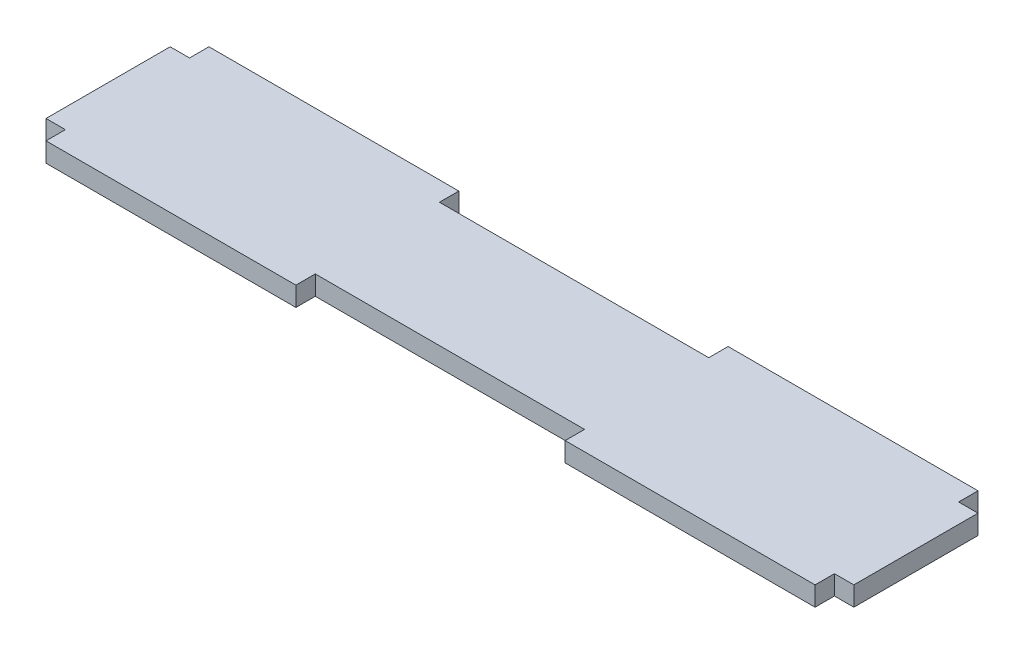
ISO-10303-21;
HEADER;
FILE_DESCRIPTION(('STEP AP214'),'2;1');
FILE_NAME('part.step','',(''),(''),'','','');
FILE_SCHEMA(('AUTOMOTIVE_DESIGN { 1 0 10303 214 1 1 1 1 }'));
ENDSEC;
DATA;
#1=APPLICATION_CONTEXT('core data for automotive mechanical design processes');
#2=APPLICATION_PROTOCOL_DEFINITION('international standard','automotive_design',2000,#1);
#3=PRODUCT_CONTEXT('',#1,'mechanical');
#4=PRODUCT('Part','Part','',(#3));
#5=PRODUCT_RELATED_PRODUCT_CATEGORY('part','',(#4));
#6=PRODUCT_DEFINITION_FORMATION('','',#4);
#7=PRODUCT_DEFINITION_CONTEXT('part definition',#1,'design');
#8=PRODUCT_DEFINITION('design','',#6,#7);
#9=PRODUCT_DEFINITION_SHAPE('','',#8);
#10=(LENGTH_UNIT() NAMED_UNIT(*) SI_UNIT(.MILLI.,.METRE.));
#11=(NAMED_UNIT(*) PLANE_ANGLE_UNIT() SI_UNIT($,.RADIAN.));
#12=(NAMED_UNIT(*) SI_UNIT($,.STERADIAN.) SOLID_ANGLE_UNIT());
#13=UNCERTAINTY_MEASURE_WITH_UNIT(LENGTH_MEASURE(1.E-05),#10,'distance_accuracy_value','');
#14=(GEOMETRIC_REPRESENTATION_CONTEXT(3) GLOBAL_UNCERTAINTY_ASSIGNED_CONTEXT((#13)) GLOBAL_UNIT_ASSIGNED_CONTEXT((#10,
#11,#12)) REPRESENTATION_CONTEXT('',''));
#15=CARTESIAN_POINT('',(0.,0.,0.));
#16=DIRECTION('',(0.,0.,1.));
#17=DIRECTION('',(1.,0.,0.));
#18=AXIS2_PLACEMENT_3D('',#15,#16,#17);
#19=CARTESIAN_POINT('',(125.,9.,-25.2125));
#20=DIRECTION('',(0.,0.,-1.));
#21=DIRECTION('',(-1.,0.,0.));
#22=AXIS2_PLACEMENT_3D('',#19,#20,#21);
#23=PLANE('',#22);
#24=DIRECTION('',(1.,0.,0.));
#25=VECTOR('',#24,1.);
#26=CARTESIAN_POINT('',(125.,3.,-25.2125));
#27=LINE('',#26,#25);
#28=CARTESIAN_POINT('',(131.,3.,-25.2125));
#29=VERTEX_POINT('',#28);
#30=CARTESIAN_POINT('',(208.333333333333,3.,-25.2125));
#31=VERTEX_POINT('',#30);
#32=EDGE_CURVE('E189',#29,#31,#27,.T.);
#33=ORIENTED_EDGE('',*,*,#32,.T.);
#34=DIRECTION('',(0.,1.,0.));
#35=VECTOR('',#34,1.);
#36=CARTESIAN_POINT('',(208.333333333333,3.,-25.2125));
#37=LINE('',#36,#35);
#38=CARTESIAN_POINT('',(208.333333333333,9.,-25.2125));
#39=VERTEX_POINT('',#38);
#40=EDGE_CURVE('E173',#31,#39,#37,.T.);
#41=ORIENTED_EDGE('',*,*,#40,.T.);
#42=DIRECTION('',(1.,0.,0.));
#43=VECTOR('',#42,1.);
#44=CARTESIAN_POINT('',(125.,9.,-25.2125));
#45=LINE('',#44,#43);
#46=CARTESIAN_POINT('',(131.,9.,-25.2125));
#47=VERTEX_POINT('',#46);
#48=EDGE_CURVE('E209',#47,#39,#45,.T.);
#49=ORIENTED_EDGE('',*,*,#48,.F.);
#50=DIRECTION('',(0.,1.,0.));
#51=VECTOR('',#50,1.);
#52=CARTESIAN_POINT('',(131.,3.,-25.2125));
#53=LINE('',#52,#51);
#54=EDGE_CURVE('E195',#29,#47,#53,.T.);
#55=ORIENTED_EDGE('',*,*,#54,.F.);
#56=EDGE_LOOP('',(#33,#41,#49,#55));
#57=FACE_BOUND('',#56,.T.);
#58=ADVANCED_FACE('F34',(#57),#23,.F.);
#59=CARTESIAN_POINT('',(125.,9.,-75.6375));
#60=DIRECTION('',(0.,0.,1.));
#61=DIRECTION('',(1.,0.,0.));
#62=AXIS2_PLACEMENT_3D('',#59,#60,#61);
#63=PLANE('',#62);
#64=DIRECTION('',(-1.,0.,0.));
#65=VECTOR('',#64,1.);
#66=CARTESIAN_POINT('',(125.,9.,-75.6375));
#67=LINE('',#66,#65);
#68=CARTESIAN_POINT('',(208.333333333333,9.,-75.6375));
#69=VERTEX_POINT('',#68);
#70=CARTESIAN_POINT('',(131.,9.,-75.6375));
#71=VERTEX_POINT('',#70);
#72=EDGE_CURVE('E43',#69,#71,#67,.T.);
#73=ORIENTED_EDGE('',*,*,#72,.F.);
#74=DIRECTION('',(0.,1.,0.));
#75=VECTOR('',#74,1.);
#76=CARTESIAN_POINT('',(208.333333333333,3.,-75.6375));
#77=LINE('',#76,#75);
#78=CARTESIAN_POINT('',(208.333333333333,3.,-75.6375));
#79=VERTEX_POINT('',#78);
#80=EDGE_CURVE('E248',#79,#69,#77,.T.);
#81=ORIENTED_EDGE('',*,*,#80,.F.);
#82=DIRECTION('',(-1.,0.,0.));
#83=VECTOR('',#82,1.);
#84=CARTESIAN_POINT('',(125.,3.,-75.6375));
#85=LINE('',#84,#83);
#86=CARTESIAN_POINT('',(131.,3.,-75.6375));
#87=VERTEX_POINT('',#86);
#88=EDGE_CURVE('E200',#79,#87,#85,.T.);
#89=ORIENTED_EDGE('',*,*,#88,.T.);
#90=DIRECTION('',(0.,1.,0.));
#91=VECTOR('',#90,1.);
#92=CARTESIAN_POINT('',(131.,3.,-75.6375));
#93=LINE('',#92,#91);
#94=EDGE_CURVE('E257',#87,#71,#93,.T.);
#95=ORIENTED_EDGE('',*,*,#94,.T.);
#96=EDGE_LOOP('',(#73,#81,#89,#95));
#97=FACE_BOUND('',#96,.T.);
#98=ADVANCED_FACE('F372',(#97),#63,.F.);
#99=CARTESIAN_POINT('',(125.,9.,-25.2125));
#100=DIRECTION('',(1.,0.,0.));
#101=DIRECTION('',(0.,0.,-1.));
#102=AXIS2_PLACEMENT_3D('',#99,#100,#101);
#103=PLANE('',#102);
#104=DIRECTION('',(0.,0.,1.));
#105=VECTOR('',#104,1.);
#106=CARTESIAN_POINT('',(125.,9.,-25.2125));
#107=LINE('',#106,#105);
#108=CARTESIAN_POINT('',(125.,9.,-69.6375));
#109=VERTEX_POINT('',#108);
#110=CARTESIAN_POINT('',(125.,9.,-31.2125));
#111=VERTEX_POINT('',#110);
#112=EDGE_CURVE('E212',#109,#111,#107,.T.);
#113=ORIENTED_EDGE('',*,*,#112,.F.);
#114=DIRECTION('',(0.,1.,0.));
#115=VECTOR('',#114,1.);
#116=CARTESIAN_POINT('',(125.,3.,-69.6375));
#117=LINE('',#116,#115);
#118=CARTESIAN_POINT('',(125.,3.,-69.6375));
#119=VERTEX_POINT('',#118);
#120=EDGE_CURVE('E252',#119,#109,#117,.T.);
#121=ORIENTED_EDGE('',*,*,#120,.F.);
#122=DIRECTION('',(0.,0.,1.));
#123=VECTOR('',#122,1.);
#124=CARTESIAN_POINT('',(125.,3.,-25.2125));
#125=LINE('',#124,#123);
#126=CARTESIAN_POINT('',(125.,3.,-31.2125));
#127=VERTEX_POINT('',#126);
#128=EDGE_CURVE('E201',#119,#127,#125,.T.);
#129=ORIENTED_EDGE('',*,*,#128,.T.);
#130=DIRECTION('',(0.,1.,0.));
#131=VECTOR('',#130,1.);
#132=CARTESIAN_POINT('',(125.,3.,-31.2125));
#133=LINE('',#132,#131);
#134=EDGE_CURVE('E238',#127,#111,#133,.T.);
#135=ORIENTED_EDGE('',*,*,#134,.T.);
#136=EDGE_LOOP('',(#113,#121,#129,#135));
#137=FACE_BOUND('',#136,.T.);
#138=ADVANCED_FACE('F36',(#137),#103,.F.);
#139=CARTESIAN_POINT('',(291.666666666667,9.,-25.2125));
#140=VERTEX_POINT('',#139);
#141=CARTESIAN_POINT('',(369.,9.,-25.2125));
#142=VERTEX_POINT('',#141);
#143=EDGE_CURVE('E211',#140,#142,#45,.T.);
#144=ORIENTED_EDGE('',*,*,#143,.F.);
#145=DIRECTION('',(0.,1.,0.));
#146=VECTOR('',#145,1.);
#147=CARTESIAN_POINT('',(291.666666666667,3.,-25.2125));
#148=LINE('',#147,#146);
#149=CARTESIAN_POINT('',(291.666666666667,3.,-25.2125));
#150=VERTEX_POINT('',#149);
#151=EDGE_CURVE('E183',#150,#140,#148,.T.);
#152=ORIENTED_EDGE('',*,*,#151,.F.);
#153=CARTESIAN_POINT('',(369.,3.,-25.2125));
#154=VERTEX_POINT('',#153);
#155=EDGE_CURVE('E197',#150,#154,#27,.T.);
#156=ORIENTED_EDGE('',*,*,#155,.T.);
#157=DIRECTION('',(0.,1.,0.));
#158=VECTOR('',#157,1.);
#159=CARTESIAN_POINT('',(369.,3.,-25.2125));
#160=LINE('',#159,#158);
#161=EDGE_CURVE('E204',#154,#142,#160,.T.);
#162=ORIENTED_EDGE('',*,*,#161,.T.);
#163=EDGE_LOOP('',(#144,#152,#156,#162));
#164=FACE_BOUND('',#163,.T.);
#165=ADVANCED_FACE('F329',(#164),#23,.F.);
#166=CARTESIAN_POINT('',(375.,9.,-25.2125));
#167=DIRECTION('',(-1.,0.,0.));
#168=DIRECTION('',(0.,0.,1.));
#169=AXIS2_PLACEMENT_3D('',#166,#167,#168);
#170=PLANE('',#169);
#171=DIRECTION('',(0.,0.,-1.));
#172=VECTOR('',#171,1.);
#173=CARTESIAN_POINT('',(375.,3.,-25.2125));
#174=LINE('',#173,#172);
#175=CARTESIAN_POINT('',(375.,3.,-31.2125));
#176=VERTEX_POINT('',#175);
#177=CARTESIAN_POINT('',(375.,3.,-69.6375));
#178=VERTEX_POINT('',#177);
#179=EDGE_CURVE('E196',#176,#178,#174,.T.);
#180=ORIENTED_EDGE('',*,*,#179,.T.);
#181=DIRECTION('',(0.,1.,0.));
#182=VECTOR('',#181,1.);
#183=CARTESIAN_POINT('',(375.,3.,-69.6375));
#184=LINE('',#183,#182);
#185=CARTESIAN_POINT('',(375.,9.,-69.6375));
#186=VERTEX_POINT('',#185);
#187=EDGE_CURVE('E229',#178,#186,#184,.T.);
#188=ORIENTED_EDGE('',*,*,#187,.T.);
#189=DIRECTION('',(0.,0.,-1.));
#190=VECTOR('',#189,1.);
#191=CARTESIAN_POINT('',(375.,9.,-25.2125));
#192=LINE('',#191,#190);
#193=CARTESIAN_POINT('',(375.,9.,-31.2125));
#194=VERTEX_POINT('',#193);
#195=EDGE_CURVE('E206',#194,#186,#192,.T.);
#196=ORIENTED_EDGE('',*,*,#195,.F.);
#197=DIRECTION('',(0.,1.,0.));
#198=VECTOR('',#197,1.);
#199=CARTESIAN_POINT('',(375.,3.,-31.2125));
#200=LINE('',#199,#198);
#201=EDGE_CURVE('E215',#176,#194,#200,.T.);
#202=ORIENTED_EDGE('',*,*,#201,.F.);
#203=EDGE_LOOP('',(#180,#188,#196,#202));
#204=FACE_BOUND('',#203,.T.);
#205=ADVANCED_FACE('F345',(#204),#170,.F.);
#206=CARTESIAN_POINT('',(369.,3.,-75.6375));
#207=VERTEX_POINT('',#206);
#208=CARTESIAN_POINT('',(291.666666666667,3.,-75.6375));
#209=VERTEX_POINT('',#208);
#210=EDGE_CURVE('E38',#207,#209,#85,.T.);
#211=ORIENTED_EDGE('',*,*,#210,.T.);
#212=DIRECTION('',(0.,1.,0.));
#213=VECTOR('',#212,1.);
#214=CARTESIAN_POINT('',(291.666666666667,3.,-75.6375));
#215=LINE('',#214,#213);
#216=CARTESIAN_POINT('',(291.666666666667,9.,-75.6375));
#217=VERTEX_POINT('',#216);
#218=EDGE_CURVE('E291',#209,#217,#215,.T.);
#219=ORIENTED_EDGE('',*,*,#218,.T.);
#220=CARTESIAN_POINT('',(369.,9.,-75.6375));
#221=VERTEX_POINT('',#220);
#222=EDGE_CURVE('E11',#221,#217,#67,.T.);
#223=ORIENTED_EDGE('',*,*,#222,.F.);
#224=DIRECTION('',(0.,1.,0.));
#225=VECTOR('',#224,1.);
#226=CARTESIAN_POINT('',(369.,3.,-75.6375));
#227=LINE('',#226,#225);
#228=EDGE_CURVE('E271',#207,#221,#227,.T.);
#229=ORIENTED_EDGE('',*,*,#228,.F.);
#230=EDGE_LOOP('',(#211,#219,#223,#229));
#231=FACE_BOUND('',#230,.T.);
#232=ADVANCED_FACE('F358',(#231),#63,.F.);
#233=CARTESIAN_POINT('',(125.,9.,-25.2125));
#234=DIRECTION('',(0.,-1.,0.));
#235=DIRECTION('',(0.,0.,-1.));
#236=AXIS2_PLACEMENT_3D('',#233,#234,#235);
#237=PLANE('',#236);
#238=ORIENTED_EDGE('',*,*,#48,.T.);
#239=DIRECTION('',(0.,0.,1.));
#240=VECTOR('',#239,1.);
#241=CARTESIAN_POINT('',(208.333333333333,9.,-25.2125));
#242=LINE('',#241,#240);
#243=CARTESIAN_POINT('',(208.333333333333,9.,-31.2125));
#244=VERTEX_POINT('',#243);
#245=EDGE_CURVE('E178',#244,#39,#242,.T.);
#246=ORIENTED_EDGE('',*,*,#245,.F.);
#247=DIRECTION('',(-1.,0.,0.));
#248=VECTOR('',#247,1.);
#249=CARTESIAN_POINT('',(208.333333333333,9.,-31.2125));
#250=LINE('',#249,#248);
#251=CARTESIAN_POINT('',(291.666666666667,9.,-31.2125));
#252=VERTEX_POINT('',#251);
#253=EDGE_CURVE('E192',#252,#244,#250,.T.);
#254=ORIENTED_EDGE('',*,*,#253,.F.);
#255=DIRECTION('',(0.,0.,-1.));
#256=VECTOR('',#255,1.);
#257=CARTESIAN_POINT('',(291.666666666667,9.,-25.2125));
#258=LINE('',#257,#256);
#259=EDGE_CURVE('E317',#140,#252,#258,.T.);
#260=ORIENTED_EDGE('',*,*,#259,.F.);
#261=ORIENTED_EDGE('',*,*,#143,.T.);
#262=DIRECTION('',(0.,0.,1.));
#263=VECTOR('',#262,1.);
#264=CARTESIAN_POINT('',(369.,9.,-25.2125));
#265=LINE('',#264,#263);
#266=CARTESIAN_POINT('',(369.,9.,-31.2125));
#267=VERTEX_POINT('',#266);
#268=EDGE_CURVE('E222',#267,#142,#265,.T.);
#269=ORIENTED_EDGE('',*,*,#268,.F.);
#270=DIRECTION('',(-1.,0.,0.));
#271=VECTOR('',#270,1.);
#272=CARTESIAN_POINT('',(375.,9.,-31.2125));
#273=LINE('',#272,#271);
#274=EDGE_CURVE('E226',#194,#267,#273,.T.);
#275=ORIENTED_EDGE('',*,*,#274,.F.);
#276=ORIENTED_EDGE('',*,*,#195,.T.);
#277=DIRECTION('',(1.,0.,0.));
#278=VECTOR('',#277,1.);
#279=CARTESIAN_POINT('',(375.,9.,-69.6375));
#280=LINE('',#279,#278);
#281=CARTESIAN_POINT('',(369.,9.,-69.6375));
#282=VERTEX_POINT('',#281);
#283=EDGE_CURVE('E278',#282,#186,#280,.T.);
#284=ORIENTED_EDGE('',*,*,#283,.F.);
#285=DIRECTION('',(0.,0.,1.));
#286=VECTOR('',#285,1.);
#287=CARTESIAN_POINT('',(369.,9.,-75.6375));
#288=LINE('',#287,#286);
#289=EDGE_CURVE('E260',#221,#282,#288,.T.);
#290=ORIENTED_EDGE('',*,*,#289,.F.);
#291=ORIENTED_EDGE('',*,*,#222,.T.);
#292=DIRECTION('',(0.,0.,-1.));
#293=VECTOR('',#292,1.);
#294=CARTESIAN_POINT('',(291.666666666667,9.,-75.6375));
#295=LINE('',#294,#293);
#296=CARTESIAN_POINT('',(291.666666666667,9.,-69.6375));
#297=VERTEX_POINT('',#296);
#298=EDGE_CURVE('E295',#297,#217,#295,.T.);
#299=ORIENTED_EDGE('',*,*,#298,.F.);
#300=DIRECTION('',(1.,0.,0.));
#301=VECTOR('',#300,1.);
#302=CARTESIAN_POINT('',(208.333333333333,9.,-69.6375));
#303=LINE('',#302,#301);
#304=CARTESIAN_POINT('',(208.333333333333,9.,-69.6375));
#305=VERTEX_POINT('',#304);
#306=EDGE_CURVE('E298',#305,#297,#303,.T.);
#307=ORIENTED_EDGE('',*,*,#306,.F.);
#308=DIRECTION('',(0.,0.,1.));
#309=VECTOR('',#308,1.);
#310=CARTESIAN_POINT('',(208.333333333333,9.,-75.6375));
#311=LINE('',#310,#309);
#312=EDGE_CURVE('E301',#69,#305,#311,.T.);
#313=ORIENTED_EDGE('',*,*,#312,.F.);
#314=ORIENTED_EDGE('',*,*,#72,.T.);
#315=DIRECTION('',(0.,0.,-1.));
#316=VECTOR('',#315,1.);
#317=CARTESIAN_POINT('',(131.,9.,-75.6375));
#318=LINE('',#317,#316);
#319=CARTESIAN_POINT('',(131.,9.,-69.6375));
#320=VERTEX_POINT('',#319);
#321=EDGE_CURVE('E261',#320,#71,#318,.T.);
#322=ORIENTED_EDGE('',*,*,#321,.F.);
#323=DIRECTION('',(1.,0.,0.));
#324=VECTOR('',#323,1.);
#325=CARTESIAN_POINT('',(125.,9.,-69.6375));
#326=LINE('',#325,#324);
#327=EDGE_CURVE('E241',#109,#320,#326,.T.);
#328=ORIENTED_EDGE('',*,*,#327,.F.);
#329=ORIENTED_EDGE('',*,*,#112,.T.);
#330=DIRECTION('',(-1.,0.,0.));
#331=VECTOR('',#330,1.);
#332=CARTESIAN_POINT('',(125.,9.,-31.2125));
#333=LINE('',#332,#331);
#334=CARTESIAN_POINT('',(131.,9.,-31.2125));
#335=VERTEX_POINT('',#334);
#336=EDGE_CURVE('E242',#335,#111,#333,.T.);
#337=ORIENTED_EDGE('',*,*,#336,.F.);
#338=DIRECTION('',(0.,0.,-1.));
#339=VECTOR('',#338,1.);
#340=CARTESIAN_POINT('',(131.,9.,-25.2125));
#341=LINE('',#340,#339);
#342=EDGE_CURVE('E245',#47,#335,#341,.T.);
#343=ORIENTED_EDGE('',*,*,#342,.F.);
#344=EDGE_LOOP('',(#238,#246,#254,#260,#261,#269,#275,#276,#284,#290,#291,#299,#307,#313,#314,
#322,#328,#329,#337,#343));
#345=FACE_BOUND('',#344,.T.);
#346=ADVANCED_FACE('F333',(#345),#237,.F.);
#347=CARTESIAN_POINT('',(125.,3.,-25.2125));
#348=DIRECTION('',(0.,-1.,0.));
#349=DIRECTION('',(0.,0.,-1.));
#350=AXIS2_PLACEMENT_3D('',#347,#348,#349);
#351=PLANE('',#350);
#352=DIRECTION('',(0.,0.,1.));
#353=VECTOR('',#352,1.);
#354=CARTESIAN_POINT('',(208.333333333333,3.,-25.2125));
#355=LINE('',#354,#353);
#356=CARTESIAN_POINT('',(208.333333333333,3.,-31.2125));
#357=VERTEX_POINT('',#356);
#358=EDGE_CURVE('E176',#357,#31,#355,.T.);
#359=ORIENTED_EDGE('',*,*,#358,.T.);
#360=ORIENTED_EDGE('',*,*,#32,.F.);
#361=DIRECTION('',(0.,0.,-1.));
#362=VECTOR('',#361,1.);
#363=CARTESIAN_POINT('',(131.,3.,-25.2125));
#364=LINE('',#363,#362);
#365=CARTESIAN_POINT('',(131.,3.,-31.2125));
#366=VERTEX_POINT('',#365);
#367=EDGE_CURVE('E244',#29,#366,#364,.T.);
#368=ORIENTED_EDGE('',*,*,#367,.T.);
#369=DIRECTION('',(-1.,0.,0.));
#370=VECTOR('',#369,1.);
#371=CARTESIAN_POINT('',(125.,3.,-31.2125));
#372=LINE('',#371,#370);
#373=EDGE_CURVE('E236',#366,#127,#372,.T.);
#374=ORIENTED_EDGE('',*,*,#373,.T.);
#375=ORIENTED_EDGE('',*,*,#128,.F.);
#376=DIRECTION('',(1.,0.,0.));
#377=VECTOR('',#376,1.);
#378=CARTESIAN_POINT('',(125.,3.,-69.6375));
#379=LINE('',#378,#377);
#380=CARTESIAN_POINT('',(131.,3.,-69.6375));
#381=VERTEX_POINT('',#380);
#382=EDGE_CURVE('E264',#119,#381,#379,.T.);
#383=ORIENTED_EDGE('',*,*,#382,.T.);
#384=DIRECTION('',(0.,0.,-1.));
#385=VECTOR('',#384,1.);
#386=CARTESIAN_POINT('',(131.,3.,-75.6375));
#387=LINE('',#386,#385);
#388=EDGE_CURVE('E255',#381,#87,#387,.T.);
#389=ORIENTED_EDGE('',*,*,#388,.T.);
#390=ORIENTED_EDGE('',*,*,#88,.F.);
#391=DIRECTION('',(0.,0.,1.));
#392=VECTOR('',#391,1.);
#393=CARTESIAN_POINT('',(208.333333333333,3.,-75.6375));
#394=LINE('',#393,#392);
#395=CARTESIAN_POINT('',(208.333333333333,3.,-69.6375));
#396=VERTEX_POINT('',#395);
#397=EDGE_CURVE('E297',#79,#396,#394,.T.);
#398=ORIENTED_EDGE('',*,*,#397,.T.);
#399=DIRECTION('',(1.,0.,0.));
#400=VECTOR('',#399,1.);
#401=CARTESIAN_POINT('',(208.333333333333,3.,-69.6375));
#402=LINE('',#401,#400);
#403=CARTESIAN_POINT('',(291.666666666667,3.,-69.6375));
#404=VERTEX_POINT('',#403);
#405=EDGE_CURVE('E306',#396,#404,#402,.T.);
#406=ORIENTED_EDGE('',*,*,#405,.T.);
#407=DIRECTION('',(0.,0.,-1.));
#408=VECTOR('',#407,1.);
#409=CARTESIAN_POINT('',(291.666666666667,3.,-75.6375));
#410=LINE('',#409,#408);
#411=EDGE_CURVE('E59',#404,#209,#410,.T.);
#412=ORIENTED_EDGE('',*,*,#411,.T.);
#413=ORIENTED_EDGE('',*,*,#210,.F.);
#414=DIRECTION('',(0.,0.,1.));
#415=VECTOR('',#414,1.);
#416=CARTESIAN_POINT('',(369.,3.,-75.6375));
#417=LINE('',#416,#415);
#418=CARTESIAN_POINT('',(369.,3.,-69.6375));
#419=VERTEX_POINT('',#418);
#420=EDGE_CURVE('E280',#207,#419,#417,.T.);
#421=ORIENTED_EDGE('',*,*,#420,.T.);
#422=DIRECTION('',(1.,0.,0.));
#423=VECTOR('',#422,1.);
#424=CARTESIAN_POINT('',(375.,3.,-69.6375));
#425=LINE('',#424,#423);
#426=EDGE_CURVE('E274',#419,#178,#425,.T.);
#427=ORIENTED_EDGE('',*,*,#426,.T.);
#428=ORIENTED_EDGE('',*,*,#179,.F.);
#429=DIRECTION('',(-1.,0.,0.));
#430=VECTOR('',#429,1.);
#431=CARTESIAN_POINT('',(375.,3.,-31.2125));
#432=LINE('',#431,#430);
#433=CARTESIAN_POINT('',(369.,3.,-31.2125));
#434=VERTEX_POINT('',#433);
#435=EDGE_CURVE('E225',#176,#434,#432,.T.);
#436=ORIENTED_EDGE('',*,*,#435,.T.);
#437=DIRECTION('',(0.,0.,1.));
#438=VECTOR('',#437,1.);
#439=CARTESIAN_POINT('',(369.,3.,-25.2125));
#440=LINE('',#439,#438);
#441=EDGE_CURVE('E218',#434,#154,#440,.T.);
#442=ORIENTED_EDGE('',*,*,#441,.T.);
#443=ORIENTED_EDGE('',*,*,#155,.F.);
#444=DIRECTION('',(0.,0.,-1.));
#445=VECTOR('',#444,1.);
#446=CARTESIAN_POINT('',(291.666666666667,3.,-25.2125));
#447=LINE('',#446,#445);
#448=CARTESIAN_POINT('',(291.666666666667,3.,-31.2125));
#449=VERTEX_POINT('',#448);
#450=EDGE_CURVE('E191',#150,#449,#447,.T.);
#451=ORIENTED_EDGE('',*,*,#450,.T.);
#452=DIRECTION('',(-1.,0.,0.));
#453=VECTOR('',#452,1.);
#454=CARTESIAN_POINT('',(208.333333333333,3.,-31.2125));
#455=LINE('',#454,#453);
#456=EDGE_CURVE('E51',#449,#357,#455,.T.);
#457=ORIENTED_EDGE('',*,*,#456,.T.);
#458=EDGE_LOOP('',(#359,#360,#368,#374,#375,#383,#389,#390,#398,#406,#412,#413,#421,#427,#428,
#436,#442,#443,#451,#457));
#459=FACE_BOUND('',#458,.T.);
#460=ADVANCED_FACE('F187',(#459),#351,.T.);
#461=CARTESIAN_POINT('',(369.,3.,-25.2125));
#462=DIRECTION('',(-1.,0.,0.));
#463=DIRECTION('',(0.,0.,1.));
#464=AXIS2_PLACEMENT_3D('',#461,#462,#463);
#465=PLANE('',#464);
#466=ORIENTED_EDGE('',*,*,#268,.T.);
#467=ORIENTED_EDGE('',*,*,#161,.F.);
#468=ORIENTED_EDGE('',*,*,#441,.F.);
#469=DIRECTION('',(0.,1.,0.));
#470=VECTOR('',#469,1.);
#471=CARTESIAN_POINT('',(369.,3.,-31.2125));
#472=LINE('',#471,#470);
#473=EDGE_CURVE('E217',#434,#267,#472,.T.);
#474=ORIENTED_EDGE('',*,*,#473,.T.);
#475=EDGE_LOOP('',(#466,#467,#468,#474));
#476=FACE_BOUND('',#475,.T.);
#477=ADVANCED_FACE('F337',(#476),#465,.F.);
#478=CARTESIAN_POINT('',(375.,3.,-31.2125));
#479=DIRECTION('',(0.,0.,-1.));
#480=DIRECTION('',(-1.,0.,0.));
#481=AXIS2_PLACEMENT_3D('',#478,#479,#480);
#482=PLANE('',#481);
#483=ORIENTED_EDGE('',*,*,#274,.T.);
#484=ORIENTED_EDGE('',*,*,#473,.F.);
#485=ORIENTED_EDGE('',*,*,#435,.F.);
#486=ORIENTED_EDGE('',*,*,#201,.T.);
#487=EDGE_LOOP('',(#483,#484,#485,#486));
#488=FACE_BOUND('',#487,.T.);
#489=ADVANCED_FACE('F340',(#488),#482,.F.);
#490=CARTESIAN_POINT('',(125.,3.,-31.2125));
#491=DIRECTION('',(0.,0.,-1.));
#492=DIRECTION('',(-1.,0.,0.));
#493=AXIS2_PLACEMENT_3D('',#490,#491,#492);
#494=PLANE('',#493);
#495=ORIENTED_EDGE('',*,*,#336,.T.);
#496=ORIENTED_EDGE('',*,*,#134,.F.);
#497=ORIENTED_EDGE('',*,*,#373,.F.);
#498=DIRECTION('',(0.,1.,0.));
#499=VECTOR('',#498,1.);
#500=CARTESIAN_POINT('',(131.,3.,-31.2125));
#501=LINE('',#500,#499);
#502=EDGE_CURVE('E235',#366,#335,#501,.T.);
#503=ORIENTED_EDGE('',*,*,#502,.T.);
#504=EDGE_LOOP('',(#495,#496,#497,#503));
#505=FACE_BOUND('',#504,.T.);
#506=ADVANCED_FACE('F388',(#505),#494,.F.);
#507=CARTESIAN_POINT('',(131.,3.,-25.2125));
#508=DIRECTION('',(1.,0.,0.));
#509=DIRECTION('',(0.,0.,-1.));
#510=AXIS2_PLACEMENT_3D('',#507,#508,#509);
#511=PLANE('',#510);
#512=ORIENTED_EDGE('',*,*,#342,.T.);
#513=ORIENTED_EDGE('',*,*,#502,.F.);
#514=ORIENTED_EDGE('',*,*,#367,.F.);
#515=ORIENTED_EDGE('',*,*,#54,.T.);
#516=EDGE_LOOP('',(#512,#513,#514,#515));
#517=FACE_BOUND('',#516,.T.);
#518=ADVANCED_FACE('F391',(#517),#511,.F.);
#519=CARTESIAN_POINT('',(131.,3.,-75.6375));
#520=DIRECTION('',(1.,0.,0.));
#521=DIRECTION('',(0.,0.,-1.));
#522=AXIS2_PLACEMENT_3D('',#519,#520,#521);
#523=PLANE('',#522);
#524=ORIENTED_EDGE('',*,*,#321,.T.);
#525=ORIENTED_EDGE('',*,*,#94,.F.);
#526=ORIENTED_EDGE('',*,*,#388,.F.);
#527=DIRECTION('',(0.,1.,0.));
#528=VECTOR('',#527,1.);
#529=CARTESIAN_POINT('',(131.,3.,-69.6375));
#530=LINE('',#529,#528);
#531=EDGE_CURVE('E254',#381,#320,#530,.T.);
#532=ORIENTED_EDGE('',*,*,#531,.T.);
#533=EDGE_LOOP('',(#524,#525,#526,#532));
#534=FACE_BOUND('',#533,.T.);
#535=ADVANCED_FACE('F376',(#534),#523,.F.);
#536=CARTESIAN_POINT('',(125.,3.,-69.6375));
#537=DIRECTION('',(0.,0.,1.));
#538=DIRECTION('',(1.,0.,0.));
#539=AXIS2_PLACEMENT_3D('',#536,#537,#538);
#540=PLANE('',#539);
#541=ORIENTED_EDGE('',*,*,#327,.T.);
#542=ORIENTED_EDGE('',*,*,#531,.F.);
#543=ORIENTED_EDGE('',*,*,#382,.F.);
#544=ORIENTED_EDGE('',*,*,#120,.T.);
#545=EDGE_LOOP('',(#541,#542,#543,#544));
#546=FACE_BOUND('',#545,.T.);
#547=ADVANCED_FACE('F381',(#546),#540,.F.);
#548=CARTESIAN_POINT('',(375.,3.,-69.6375));
#549=DIRECTION('',(0.,0.,1.));
#550=DIRECTION('',(1.,0.,0.));
#551=AXIS2_PLACEMENT_3D('',#548,#549,#550);
#552=PLANE('',#551);
#553=ORIENTED_EDGE('',*,*,#283,.T.);
#554=ORIENTED_EDGE('',*,*,#187,.F.);
#555=ORIENTED_EDGE('',*,*,#426,.F.);
#556=DIRECTION('',(0.,1.,0.));
#557=VECTOR('',#556,1.);
#558=CARTESIAN_POINT('',(369.,3.,-69.6375));
#559=LINE('',#558,#557);
#560=EDGE_CURVE('E273',#419,#282,#559,.T.);
#561=ORIENTED_EDGE('',*,*,#560,.T.);
#562=EDGE_LOOP('',(#553,#554,#555,#561));
#563=FACE_BOUND('',#562,.T.);
#564=ADVANCED_FACE('F348',(#563),#552,.F.);
#565=CARTESIAN_POINT('',(369.,3.,-75.6375));
#566=DIRECTION('',(-1.,0.,0.));
#567=DIRECTION('',(0.,0.,1.));
#568=AXIS2_PLACEMENT_3D('',#565,#566,#567);
#569=PLANE('',#568);
#570=ORIENTED_EDGE('',*,*,#289,.T.);
#571=ORIENTED_EDGE('',*,*,#560,.F.);
#572=ORIENTED_EDGE('',*,*,#420,.F.);
#573=ORIENTED_EDGE('',*,*,#228,.T.);
#574=EDGE_LOOP('',(#570,#571,#572,#573));
#575=FACE_BOUND('',#574,.T.);
#576=ADVANCED_FACE('F354',(#575),#569,.F.);
#577=CARTESIAN_POINT('',(208.333333333333,3.,-75.6375));
#578=DIRECTION('',(-1.,0.,0.));
#579=DIRECTION('',(0.,0.,1.));
#580=AXIS2_PLACEMENT_3D('',#577,#578,#579);
#581=PLANE('',#580);
#582=ORIENTED_EDGE('',*,*,#312,.T.);
#583=DIRECTION('',(0.,1.,0.));
#584=VECTOR('',#583,1.);
#585=CARTESIAN_POINT('',(208.333333333333,3.,-69.6375));
#586=LINE('',#585,#584);
#587=EDGE_CURVE('E287',#396,#305,#586,.T.);
#588=ORIENTED_EDGE('',*,*,#587,.F.);
#589=ORIENTED_EDGE('',*,*,#397,.F.);
#590=ORIENTED_EDGE('',*,*,#80,.T.);
#591=EDGE_LOOP('',(#582,#588,#589,#590));
#592=FACE_BOUND('',#591,.T.);
#593=ADVANCED_FACE('F367',(#592),#581,.F.);
#594=CARTESIAN_POINT('',(291.666666666667,3.,-75.6375));
#595=DIRECTION('',(1.,0.,0.));
#596=DIRECTION('',(0.,0.,-1.));
#597=AXIS2_PLACEMENT_3D('',#594,#595,#596);
#598=PLANE('',#597);
#599=ORIENTED_EDGE('',*,*,#298,.T.);
#600=ORIENTED_EDGE('',*,*,#218,.F.);
#601=ORIENTED_EDGE('',*,*,#411,.F.);
#602=DIRECTION('',(0.,1.,0.));
#603=VECTOR('',#602,1.);
#604=CARTESIAN_POINT('',(291.666666666667,3.,-69.6375));
#605=LINE('',#604,#603);
#606=EDGE_CURVE('E289',#404,#297,#605,.T.);
#607=ORIENTED_EDGE('',*,*,#606,.T.);
#608=EDGE_LOOP('',(#599,#600,#601,#607));
#609=FACE_BOUND('',#608,.T.);
#610=ADVANCED_FACE('F362',(#609),#598,.F.);
#611=CARTESIAN_POINT('',(208.333333333333,3.,-69.6375));
#612=DIRECTION('',(0.,0.,1.));
#613=DIRECTION('',(1.,0.,0.));
#614=AXIS2_PLACEMENT_3D('',#611,#612,#613);
#615=PLANE('',#614);
#616=ORIENTED_EDGE('',*,*,#306,.T.);
#617=ORIENTED_EDGE('',*,*,#606,.F.);
#618=ORIENTED_EDGE('',*,*,#405,.F.);
#619=ORIENTED_EDGE('',*,*,#587,.T.);
#620=EDGE_LOOP('',(#616,#617,#618,#619));
#621=FACE_BOUND('',#620,.T.);
#622=ADVANCED_FACE('F365',(#621),#615,.F.);
#623=CARTESIAN_POINT('',(208.333333333333,3.,-25.2125));
#624=DIRECTION('',(-1.,0.,0.));
#625=DIRECTION('',(0.,0.,1.));
#626=AXIS2_PLACEMENT_3D('',#623,#624,#625);
#627=PLANE('',#626);
#628=ORIENTED_EDGE('',*,*,#245,.T.);
#629=ORIENTED_EDGE('',*,*,#40,.F.);
#630=ORIENTED_EDGE('',*,*,#358,.F.);
#631=DIRECTION('',(0.,1.,0.));
#632=VECTOR('',#631,1.);
#633=CARTESIAN_POINT('',(208.333333333333,3.,-31.2125));
#634=LINE('',#633,#632);
#635=EDGE_CURVE('E304',#357,#244,#634,.T.);
#636=ORIENTED_EDGE('',*,*,#635,.T.);
#637=EDGE_LOOP('',(#628,#629,#630,#636));
#638=FACE_BOUND('',#637,.T.);
#639=ADVANCED_FACE('F175',(#638),#627,.F.);
#640=CARTESIAN_POINT('',(208.333333333333,3.,-31.2125));
#641=DIRECTION('',(0.,0.,-1.));
#642=DIRECTION('',(-1.,0.,0.));
#643=AXIS2_PLACEMENT_3D('',#640,#641,#642);
#644=PLANE('',#643);
#645=ORIENTED_EDGE('',*,*,#253,.T.);
#646=ORIENTED_EDGE('',*,*,#635,.F.);
#647=ORIENTED_EDGE('',*,*,#456,.F.);
#648=DIRECTION('',(0.,1.,0.));
#649=VECTOR('',#648,1.);
#650=CARTESIAN_POINT('',(291.666666666667,3.,-31.2125));
#651=LINE('',#650,#649);
#652=EDGE_CURVE('E312',#449,#252,#651,.T.);
#653=ORIENTED_EDGE('',*,*,#652,.T.);
#654=EDGE_LOOP('',(#645,#646,#647,#653));
#655=FACE_BOUND('',#654,.T.);
#656=ADVANCED_FACE('F455',(#655),#644,.F.);
#657=CARTESIAN_POINT('',(291.666666666667,3.,-25.2125));
#658=DIRECTION('',(1.,0.,0.));
#659=DIRECTION('',(0.,0.,-1.));
#660=AXIS2_PLACEMENT_3D('',#657,#658,#659);
#661=PLANE('',#660);
#662=ORIENTED_EDGE('',*,*,#259,.T.);
#663=ORIENTED_EDGE('',*,*,#652,.F.);
#664=ORIENTED_EDGE('',*,*,#450,.F.);
#665=ORIENTED_EDGE('',*,*,#151,.T.);
#666=EDGE_LOOP('',(#662,#663,#664,#665));
#667=FACE_BOUND('',#666,.T.);
#668=ADVANCED_FACE('F325',(#667),#661,.F.);
#669=CLOSED_SHELL('',(#58,#98,#138,#165,#205,#232,#346,#460,#477,#489,#506,#518,#535,#547,#564,
#576,#593,#610,#622,#639,#656,#668));
#670=MANIFOLD_SOLID_BREP('B2',#669);
#671=ADVANCED_BREP_SHAPE_REPRESENTATION('',(#18,#670),#14);
#672=SHAPE_DEFINITION_REPRESENTATION(#9,#671);
ENDSEC;
END-ISO-10303-21;
